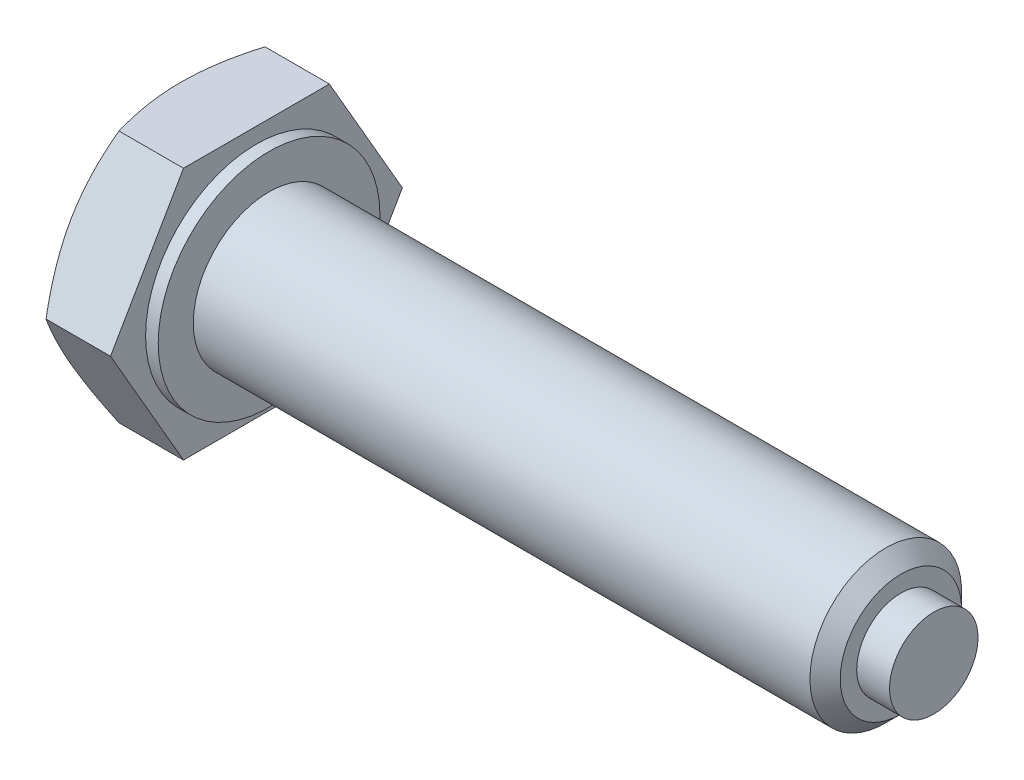
ISO-10303-21;
HEADER;
FILE_DESCRIPTION(('STEP AP214'),'2;1');
FILE_NAME('part.step','',(''),(''),'','','');
FILE_SCHEMA(('AUTOMOTIVE_DESIGN { 1 0 10303 214 1 1 1 1 }'));
ENDSEC;
DATA;
#1=APPLICATION_CONTEXT('core data for automotive mechanical design processes');
#2=APPLICATION_PROTOCOL_DEFINITION('international standard','automotive_design',2000,#1);
#3=PRODUCT_CONTEXT('',#1,'mechanical');
#4=PRODUCT('Part','Part','',(#3));
#5=PRODUCT_RELATED_PRODUCT_CATEGORY('part','',(#4));
#6=PRODUCT_DEFINITION_FORMATION('','',#4);
#7=PRODUCT_DEFINITION_CONTEXT('part definition',#1,'design');
#8=PRODUCT_DEFINITION('design','',#6,#7);
#9=PRODUCT_DEFINITION_SHAPE('','',#8);
#10=(LENGTH_UNIT() NAMED_UNIT(*) SI_UNIT(.MILLI.,.METRE.));
#11=(NAMED_UNIT(*) PLANE_ANGLE_UNIT() SI_UNIT($,.RADIAN.));
#12=(NAMED_UNIT(*) SI_UNIT($,.STERADIAN.) SOLID_ANGLE_UNIT());
#13=UNCERTAINTY_MEASURE_WITH_UNIT(LENGTH_MEASURE(1.E-05),#10,'distance_accuracy_value','');
#14=(GEOMETRIC_REPRESENTATION_CONTEXT(3) GLOBAL_UNCERTAINTY_ASSIGNED_CONTEXT((#13)) GLOBAL_UNIT_ASSIGNED_CONTEXT((#10,
#11,#12)) REPRESENTATION_CONTEXT('',''));
#15=CARTESIAN_POINT('',(0.,0.,0.));
#16=DIRECTION('',(0.,0.,1.));
#17=DIRECTION('',(1.,0.,0.));
#18=AXIS2_PLACEMENT_3D('',#15,#16,#17);
#19=CARTESIAN_POINT('',(6.5,-2.5,-4.33012701892221));
#20=DIRECTION('',(0.,-0.5,-0.866025403784439));
#21=DIRECTION('',(0.,-0.866025403784439,0.5));
#22=AXIS2_PLACEMENT_3D('',#19,#20,#21);
#23=PLANE('',#22);
#24=CARTESIAN_POINT('',(-3.05341801261481,-5.,-2.88675134594815));
#25=CARTESIAN_POINT('',(-3.5,-3.660254037848,-3.66025403784232));
#26=CARTESIAN_POINT('',(-3.5,-2.5,-4.33012701892221));
#27=B_SPLINE_CURVE_WITH_KNOTS('',2,(#24,#25,#26),.UNSPECIFIED.,.F.,.F.,(3,3),(0.,1.),.UNSPECIFIED.);
#28=CARTESIAN_POINT('',(-3.0534180126148,-5.,-2.88675134594811));
#29=VERTEX_POINT('',#28);
#30=CARTESIAN_POINT('',(-3.5,-2.5,-4.33012701892219));
#31=VERTEX_POINT('',#30);
#32=EDGE_CURVE('E218',#29,#31,#27,.T.);
#33=ORIENTED_EDGE('',*,*,#32,.T.);
#34=CARTESIAN_POINT('',(-3.5,-2.5,-4.33012701892221));
#35=CARTESIAN_POINT('',(-3.5,-1.88094418422438,-4.68753906080368));
#36=CARTESIAN_POINT('',(-3.37944642779345,-1.23558849293271,-5.06013534289397));
#37=CARTESIAN_POINT('',(-3.27002278937836,-0.649814330288887,-5.39833221338071));
#38=CARTESIAN_POINT('',(-3.05341801261481,0.,-5.77350269189627));
#39=B_SPLINE_CURVE_WITH_KNOTS('',2,(#34,#35,#36,#37,#38),.UNSPECIFIED.,.F.,.F.,(3,2,3),(0.,0.5,
1.),.UNSPECIFIED.);
#40=CARTESIAN_POINT('',(-3.05341801261481,0.,-5.77350269189625));
#41=VERTEX_POINT('',#40);
#42=EDGE_CURVE('E208',#31,#41,#39,.T.);
#43=ORIENTED_EDGE('',*,*,#42,.T.);
#44=DIRECTION('',(-1.,0.,0.));
#45=VECTOR('',#44,1.);
#46=CARTESIAN_POINT('',(6.5,0.,-5.77350269189626));
#47=LINE('',#46,#45);
#48=CARTESIAN_POINT('',(-0.5,0.,-5.77350269189629));
#49=VERTEX_POINT('',#48);
#50=EDGE_CURVE('E235',#49,#41,#47,.T.);
#51=ORIENTED_EDGE('',*,*,#50,.F.);
#52=DIRECTION('',(0.,-0.866025403784439,0.5));
#53=VECTOR('',#52,1.);
#54=CARTESIAN_POINT('',(-0.499999999999987,1.83012701892221,-6.83012701892217));
#55=LINE('',#54,#53);
#56=CARTESIAN_POINT('',(-0.5,-5.,-2.88675134594812));
#57=VERTEX_POINT('',#56);
#58=EDGE_CURVE('E503',#49,#57,#55,.T.);
#59=ORIENTED_EDGE('',*,*,#58,.T.);
#60=DIRECTION('',(-1.,0.,0.));
#61=VECTOR('',#60,1.);
#62=CARTESIAN_POINT('',(6.50000000000001,-5.,-2.88675134594812));
#63=LINE('',#62,#61);
#64=EDGE_CURVE('E11',#57,#29,#63,.T.);
#65=ORIENTED_EDGE('',*,*,#64,.T.);
#66=EDGE_LOOP('',(#33,#43,#51,#59,#65));
#67=FACE_BOUND('',#66,.T.);
#68=ADVANCED_FACE('F16',(#67),#23,.T.);
#69=CARTESIAN_POINT('',(6.5,-5.00000000000006,0.));
#70=DIRECTION('',(0.,-1.,0.));
#71=DIRECTION('',(0.,0.,-1.));
#72=AXIS2_PLACEMENT_3D('',#69,#70,#71);
#73=PLANE('',#72);
#74=CARTESIAN_POINT('',(-3.05341801261481,-5.00000000000006,2.88675134594809));
#75=CARTESIAN_POINT('',(-3.26907633651162,-5.00000000000006,2.13968899781922));
#76=CARTESIAN_POINT('',(-3.37864447292294,-5.00000000000006,1.46496446326328));
#77=CARTESIAN_POINT('',(-3.5,-5.00000000000006,0.717652751987256));
#78=CARTESIAN_POINT('',(-3.5,-5.00000000000006,0.));
#79=B_SPLINE_CURVE_WITH_KNOTS('',2,(#74,#75,#76,#77,#78),.UNSPECIFIED.,.F.,.F.,(3,2,3),(0.,0.5,
1.),.UNSPECIFIED.);
#80=CARTESIAN_POINT('',(-3.0534180126148,-5.,2.88675134594811));
#81=VERTEX_POINT('',#80);
#82=CARTESIAN_POINT('',(-3.49999999999999,-5.,0.));
#83=VERTEX_POINT('',#82);
#84=EDGE_CURVE('E161',#81,#83,#79,.T.);
#85=ORIENTED_EDGE('',*,*,#84,.T.);
#86=CARTESIAN_POINT('',(-3.5,-5.00000000000006,0.));
#87=CARTESIAN_POINT('',(-3.5,-5.00000000000006,-0.712189626387357));
#88=CARTESIAN_POINT('',(-3.3803501939515,-5.00000000000006,-1.45442210522949));
#89=CARTESIAN_POINT('',(-3.27090399188261,-5.00000000000006,-2.13335781389684));
#90=CARTESIAN_POINT('',(-3.05341801261481,-5.00000000000006,-2.88675134594814));
#91=B_SPLINE_CURVE_WITH_KNOTS('',2,(#86,#87,#88,#89,#90),.UNSPECIFIED.,.F.,.F.,(3,2,3),(0.,0.5,
1.),.UNSPECIFIED.);
#92=EDGE_CURVE('E492',#83,#29,#91,.T.);
#93=ORIENTED_EDGE('',*,*,#92,.T.);
#94=ORIENTED_EDGE('',*,*,#64,.F.);
#95=DIRECTION('',(0.,0.,1.));
#96=VECTOR('',#95,1.);
#97=CARTESIAN_POINT('',(-0.499999999999994,-5.,0.));
#98=LINE('',#97,#96);
#99=CARTESIAN_POINT('',(-0.499999999999994,-5.,2.88675134594812));
#100=VERTEX_POINT('',#99);
#101=EDGE_CURVE('E157',#57,#100,#98,.T.);
#102=ORIENTED_EDGE('',*,*,#101,.T.);
#103=DIRECTION('',(-1.,0.,0.));
#104=VECTOR('',#103,1.);
#105=CARTESIAN_POINT('',(6.50000000000001,-5.,2.88675134594807));
#106=LINE('',#105,#104);
#107=EDGE_CURVE('E29',#100,#81,#106,.T.);
#108=ORIENTED_EDGE('',*,*,#107,.T.);
#109=EDGE_LOOP('',(#85,#93,#94,#102,#108));
#110=FACE_BOUND('',#109,.T.);
#111=ADVANCED_FACE('F394',(#110),#73,.T.);
#112=CARTESIAN_POINT('',(6.50000000000001,-2.5,4.33012701892217));
#113=DIRECTION('',(0.,-0.5,0.866025403784439));
#114=DIRECTION('',(-1.,0.,0.));
#115=AXIS2_PLACEMENT_3D('',#112,#113,#114);
#116=PLANE('',#115);
#117=CARTESIAN_POINT('',(-3.0534180126148,0.,5.77350269189623));
#118=CARTESIAN_POINT('',(-3.49999999999999,-1.339745962152,5.00000000000206));
#119=CARTESIAN_POINT('',(-3.49999999999999,-2.5,4.33012701892217));
#120=B_SPLINE_CURVE_WITH_KNOTS('',2,(#117,#118,#119),.UNSPECIFIED.,.F.,.F.,(3,3),(0.,1.),.UNSPECIFIED.);
#121=CARTESIAN_POINT('',(-3.0534180126148,0.,5.77350269189621));
#122=VERTEX_POINT('',#121);
#123=CARTESIAN_POINT('',(-3.5,-2.5,4.33012701892216));
#124=VERTEX_POINT('',#123);
#125=EDGE_CURVE('E356',#122,#124,#120,.T.);
#126=ORIENTED_EDGE('',*,*,#125,.T.);
#127=CARTESIAN_POINT('',(-3.49999999999999,-2.5,4.33012701892217));
#128=CARTESIAN_POINT('',(-3.49999999999999,-3.11905581578245,3.97271497703677));
#129=CARTESIAN_POINT('',(-3.37944642779343,-3.76441150706729,3.60011869495041));
#130=CARTESIAN_POINT('',(-3.27002278937571,-4.35018566971901,3.26192182445911));
#131=CARTESIAN_POINT('',(-3.0534180126148,-4.99999999999999,2.88675134594811));
#132=B_SPLINE_CURVE_WITH_KNOTS('',2,(#127,#128,#129,#130,#131),.UNSPECIFIED.,.F.,.F.,(3,2,3),
(0.,0.5,1.),.UNSPECIFIED.);
#133=EDGE_CURVE('E368',#124,#81,#132,.T.);
#134=ORIENTED_EDGE('',*,*,#133,.T.);
#135=ORIENTED_EDGE('',*,*,#107,.F.);
#136=DIRECTION('',(0.,0.866025403784439,0.5));
#137=VECTOR('',#136,1.);
#138=CARTESIAN_POINT('',(-0.499999999999994,1.83012701892221,6.83012701892215));
#139=LINE('',#138,#137);
#140=CARTESIAN_POINT('',(-0.49999999999999,0.,5.77350269189623));
#141=VERTEX_POINT('',#140);
#142=EDGE_CURVE('E155',#100,#141,#139,.T.);
#143=ORIENTED_EDGE('',*,*,#142,.T.);
#144=DIRECTION('',(-1.,0.,0.));
#145=VECTOR('',#144,1.);
#146=CARTESIAN_POINT('',(6.50000000000001,0.,5.77350269189622));
#147=LINE('',#146,#145);
#148=EDGE_CURVE('E409',#141,#122,#147,.T.);
#149=ORIENTED_EDGE('',*,*,#148,.T.);
#150=EDGE_LOOP('',(#126,#134,#135,#143,#149));
#151=FACE_BOUND('',#150,.T.);
#152=ADVANCED_FACE('F336',(#151),#116,.T.);
#153=CARTESIAN_POINT('',(6.5,2.5,4.33012701892214));
#154=DIRECTION('',(0.,0.5,0.866025403784439));
#155=DIRECTION('',(1.,0.,0.));
#156=AXIS2_PLACEMENT_3D('',#153,#154,#155);
#157=PLANE('',#156);
#158=CARTESIAN_POINT('',(-3.05341801261481,4.99999999999999,2.88675134594808));
#159=CARTESIAN_POINT('',(-3.5,3.660254037848,3.66025403784225));
#160=CARTESIAN_POINT('',(-3.5,2.5,4.33012701892214));
#161=B_SPLINE_CURVE_WITH_KNOTS('',2,(#158,#159,#160),.UNSPECIFIED.,.F.,.F.,(3,3),(0.,1.),.UNSPECIFIED.);
#162=CARTESIAN_POINT('',(-3.0534180126148,5.,2.88675134594808));
#163=VERTEX_POINT('',#162);
#164=CARTESIAN_POINT('',(-3.5,2.5,4.33012701892216));
#165=VERTEX_POINT('',#164);
#166=EDGE_CURVE('E313',#163,#165,#161,.T.);
#167=ORIENTED_EDGE('',*,*,#166,.T.);
#168=CARTESIAN_POINT('',(-3.5,2.5,4.33012701892214));
#169=CARTESIAN_POINT('',(-3.5,1.88094418422412,4.68753906080376));
#170=CARTESIAN_POINT('',(-3.37944642779345,1.23558849293271,5.0601353428939));
#171=CARTESIAN_POINT('',(-3.27002278937826,0.649814330288593,5.39833221338081));
#172=CARTESIAN_POINT('',(-3.05341801261481,0.,5.7735026918962));
#173=B_SPLINE_CURVE_WITH_KNOTS('',2,(#168,#169,#170,#171,#172),.UNSPECIFIED.,.F.,.F.,(3,2,3),
(0.,0.5,1.),.UNSPECIFIED.);
#174=EDGE_CURVE('E314',#165,#122,#173,.T.);
#175=ORIENTED_EDGE('',*,*,#174,.T.);
#176=ORIENTED_EDGE('',*,*,#148,.F.);
#177=DIRECTION('',(0.,0.866025403784439,-0.5));
#178=VECTOR('',#177,1.);
#179=CARTESIAN_POINT('',(-0.499999999999997,6.83012701892216,1.83012701892216));
#180=LINE('',#179,#178);
#181=CARTESIAN_POINT('',(-0.499999999999997,4.99999999999995,2.88675134594811));
#182=VERTEX_POINT('',#181);
#183=EDGE_CURVE('E151',#141,#182,#180,.T.);
#184=ORIENTED_EDGE('',*,*,#183,.T.);
#185=DIRECTION('',(-1.,0.,0.));
#186=VECTOR('',#185,1.);
#187=CARTESIAN_POINT('',(6.5,4.99999999999995,2.8867513459481));
#188=LINE('',#187,#186);
#189=EDGE_CURVE('E280',#182,#163,#188,.T.);
#190=ORIENTED_EDGE('',*,*,#189,.T.);
#191=EDGE_LOOP('',(#167,#175,#176,#184,#190));
#192=FACE_BOUND('',#191,.T.);
#193=ADVANCED_FACE('F255',(#192),#157,.T.);
#194=CARTESIAN_POINT('',(6.50000000000001,5.,0.));
#195=DIRECTION('',(0.,1.,0.));
#196=DIRECTION('',(0.,0.,-1.));
#197=AXIS2_PLACEMENT_3D('',#194,#195,#196);
#198=PLANE('',#197);
#199=CARTESIAN_POINT('',(-3.0534180126148,5.00000000000001,-2.88675134594815));
#200=CARTESIAN_POINT('',(-3.27073255317133,5.00000000000001,-2.13395169501346));
#201=CARTESIAN_POINT('',(-3.38035019395149,5.00000000000001,-1.45442210522949));
#202=CARTESIAN_POINT('',(-3.49999999999999,5.,-0.712702222889343));
#203=CARTESIAN_POINT('',(-3.49999999999999,5.,0.));
#204=B_SPLINE_CURVE_WITH_KNOTS('',2,(#199,#200,#201,#202,#203),.UNSPECIFIED.,.F.,.F.,(3,2,3),
(0.,0.5,1.),.UNSPECIFIED.);
#205=CARTESIAN_POINT('',(-3.0534180126148,4.99999999999995,-2.88675134594814));
#206=VERTEX_POINT('',#205);
#207=CARTESIAN_POINT('',(-3.5,4.99999999999995,0.));
#208=VERTEX_POINT('',#207);
#209=EDGE_CURVE('E241',#206,#208,#204,.T.);
#210=ORIENTED_EDGE('',*,*,#209,.T.);
#211=CARTESIAN_POINT('',(-3.49999999999999,5.,0.));
#212=CARTESIAN_POINT('',(-3.49999999999999,5.,0.717140252018308));
#213=CARTESIAN_POINT('',(-3.37864447292293,5.,1.46496446326328));
#214=CARTESIAN_POINT('',(-3.26924783142741,5.,2.13909492200443));
#215=CARTESIAN_POINT('',(-3.0534180126148,5.,2.88675134594809));
#216=B_SPLINE_CURVE_WITH_KNOTS('',2,(#211,#212,#213,#214,#215),.UNSPECIFIED.,.F.,.F.,(3,2,3),
(0.,0.5,1.),.UNSPECIFIED.);
#217=EDGE_CURVE('E275',#208,#163,#216,.T.);
#218=ORIENTED_EDGE('',*,*,#217,.T.);
#219=ORIENTED_EDGE('',*,*,#189,.F.);
#220=DIRECTION('',(0.,0.,-1.));
#221=VECTOR('',#220,1.);
#222=CARTESIAN_POINT('',(-0.5,4.99999999999995,0.));
#223=LINE('',#222,#221);
#224=CARTESIAN_POINT('',(-0.5,5.,-2.88675134594815));
#225=VERTEX_POINT('',#224);
#226=EDGE_CURVE('E156',#182,#225,#223,.T.);
#227=ORIENTED_EDGE('',*,*,#226,.T.);
#228=DIRECTION('',(-1.,0.,0.));
#229=VECTOR('',#228,1.);
#230=CARTESIAN_POINT('',(6.50000000000001,5.,-2.88675134594814));
#231=LINE('',#230,#229);
#232=EDGE_CURVE('E44',#225,#206,#231,.T.);
#233=ORIENTED_EDGE('',*,*,#232,.T.);
#234=EDGE_LOOP('',(#210,#218,#219,#227,#233));
#235=FACE_BOUND('',#234,.T.);
#236=ADVANCED_FACE('F184',(#235),#198,.T.);
#237=CARTESIAN_POINT('',(6.5,2.5,-4.3301270189222));
#238=DIRECTION('',(0.,0.5,-0.866025403784439));
#239=DIRECTION('',(-1.,0.,0.));
#240=AXIS2_PLACEMENT_3D('',#237,#238,#239);
#241=PLANE('',#240);
#242=CARTESIAN_POINT('',(-3.05341801261481,0.,-5.77350269189626));
#243=CARTESIAN_POINT('',(-3.5,1.339745962152,-5.0000000000021));
#244=CARTESIAN_POINT('',(-3.5,2.5,-4.3301270189222));
#245=B_SPLINE_CURVE_WITH_KNOTS('',2,(#242,#243,#244),.UNSPECIFIED.,.F.,.F.,(3,3),(0.,1.),.UNSPECIFIED.);
#246=CARTESIAN_POINT('',(-3.49999999999999,2.5,-4.33012701892217));
#247=VERTEX_POINT('',#246);
#248=EDGE_CURVE('E205',#41,#247,#245,.T.);
#249=ORIENTED_EDGE('',*,*,#248,.T.);
#250=CARTESIAN_POINT('',(-3.5,2.5,-4.3301270189222));
#251=CARTESIAN_POINT('',(-3.5,3.11905581577575,-3.97271497704067));
#252=CARTESIAN_POINT('',(-3.37944642779344,3.76441150706729,-3.60011869495044));
#253=CARTESIAN_POINT('',(-3.27002278937831,4.35018566971127,-3.26192182446361));
#254=CARTESIAN_POINT('',(-3.05341801261481,4.99999999999999,-2.88675134594814));
#255=B_SPLINE_CURVE_WITH_KNOTS('',2,(#250,#251,#252,#253,#254),.UNSPECIFIED.,.F.,.F.,(3,2,3),
(0.,0.5,1.),.UNSPECIFIED.);
#256=EDGE_CURVE('E166',#247,#206,#255,.T.);
#257=ORIENTED_EDGE('',*,*,#256,.T.);
#258=ORIENTED_EDGE('',*,*,#232,.F.);
#259=DIRECTION('',(0.,-0.866025403784439,-0.5));
#260=VECTOR('',#259,1.);
#261=CARTESIAN_POINT('',(-0.499999999999994,6.83012701892216,-1.8301270189222));
#262=LINE('',#261,#260);
#263=EDGE_CURVE('E508',#225,#49,#262,.T.);
#264=ORIENTED_EDGE('',*,*,#263,.T.);
#265=ORIENTED_EDGE('',*,*,#50,.T.);
#266=EDGE_LOOP('',(#249,#257,#258,#264,#265));
#267=FACE_BOUND('',#266,.T.);
#268=ADVANCED_FACE('F173',(#267),#241,.T.);
#269=CARTESIAN_POINT('',(-3.5,0.,0.));
#270=DIRECTION('',(1.,0.,0.));
#271=DIRECTION('',(0.,1.,0.));
#272=AXIS2_PLACEMENT_3D('',#269,#270,#271);
#273=PLANE('',#272);
#274=CARTESIAN_POINT('',(-3.5,0.,0.));
#275=DIRECTION('',(-1.,0.,0.));
#276=DIRECTION('',(0.,0.,1.));
#277=AXIS2_PLACEMENT_3D('',#274,#275,#276);
#278=CIRCLE('',#277,5.);
#279=EDGE_CURVE('E211',#247,#31,#278,.T.);
#280=ORIENTED_EDGE('',*,*,#279,.T.);
#281=CARTESIAN_POINT('',(-3.5,0.,0.));
#282=DIRECTION('',(-1.,0.,0.));
#283=DIRECTION('',(0.,0.,1.));
#284=AXIS2_PLACEMENT_3D('',#281,#282,#283);
#285=CIRCLE('',#284,5.);
#286=EDGE_CURVE('E496',#31,#83,#285,.T.);
#287=ORIENTED_EDGE('',*,*,#286,.T.);
#288=CARTESIAN_POINT('',(-3.5,0.,0.));
#289=DIRECTION('',(-1.,0.,0.));
#290=DIRECTION('',(0.,0.,1.));
#291=AXIS2_PLACEMENT_3D('',#288,#289,#290);
#292=CIRCLE('',#291,5.);
#293=EDGE_CURVE('E352',#83,#124,#292,.T.);
#294=ORIENTED_EDGE('',*,*,#293,.T.);
#295=CARTESIAN_POINT('',(-3.5,0.,0.));
#296=DIRECTION('',(-1.,0.,0.));
#297=DIRECTION('',(0.,0.,1.));
#298=AXIS2_PLACEMENT_3D('',#295,#296,#297);
#299=CIRCLE('',#298,5.);
#300=EDGE_CURVE('E304',#124,#165,#299,.T.);
#301=ORIENTED_EDGE('',*,*,#300,.T.);
#302=CARTESIAN_POINT('',(-3.5,0.,0.));
#303=DIRECTION('',(-1.,0.,0.));
#304=DIRECTION('',(0.,0.,1.));
#305=AXIS2_PLACEMENT_3D('',#302,#303,#304);
#306=CIRCLE('',#305,5.);
#307=EDGE_CURVE('E351',#165,#208,#306,.T.);
#308=ORIENTED_EDGE('',*,*,#307,.T.);
#309=CARTESIAN_POINT('',(-3.5,0.,0.));
#310=DIRECTION('',(-1.,0.,0.));
#311=DIRECTION('',(0.,0.,1.));
#312=AXIS2_PLACEMENT_3D('',#309,#310,#311);
#313=CIRCLE('',#312,5.);
#314=EDGE_CURVE('E236',#208,#247,#313,.T.);
#315=ORIENTED_EDGE('',*,*,#314,.T.);
#316=EDGE_LOOP('',(#280,#287,#294,#301,#308,#315));
#317=FACE_BOUND('',#316,.T.);
#318=ADVANCED_FACE('F183',(#317),#273,.F.);
#319=CARTESIAN_POINT('',(26.3,1.74999999999997,0.));
#320=DIRECTION('',(-1.,0.,0.));
#321=DIRECTION('',(0.,0.,1.));
#322=AXIS2_PLACEMENT_3D('',#319,#320,#321);
#323=PLANE('',#322);
#324=CARTESIAN_POINT('',(26.3,0.,0.));
#325=DIRECTION('',(-1.,0.,0.));
#326=DIRECTION('',(0.,0.,1.));
#327=AXIS2_PLACEMENT_3D('',#324,#325,#326);
#328=CIRCLE('',#327,1.75);
#329=CARTESIAN_POINT('',(26.3,0.,-1.75));
#330=VERTEX_POINT('',#329);
#331=EDGE_CURVE('E619',#330,#330,#328,.T.);
#332=ORIENTED_EDGE('',*,*,#331,.F.);
#333=EDGE_LOOP('',(#332));
#334=FACE_BOUND('',#333,.T.);
#335=ADVANCED_FACE('F337',(#334),#323,.F.);
#336=CARTESIAN_POINT('',(25.,2.40000000000001,0.));
#337=DIRECTION('',(-1.,0.,0.));
#338=DIRECTION('',(0.,0.,1.));
#339=AXIS2_PLACEMENT_3D('',#336,#337,#338);
#340=PLANE('',#339);
#341=CARTESIAN_POINT('',(25.,0.,0.));
#342=DIRECTION('',(-1.,0.,0.));
#343=DIRECTION('',(0.,0.,1.));
#344=AXIS2_PLACEMENT_3D('',#341,#342,#343);
#345=CIRCLE('',#344,1.75);
#346=CARTESIAN_POINT('',(25.,0.,1.74999999999997));
#347=VERTEX_POINT('',#346);
#348=EDGE_CURVE('E624',#347,#347,#345,.T.);
#349=ORIENTED_EDGE('',*,*,#348,.T.);
#350=EDGE_LOOP('',(#349));
#351=FACE_BOUND('',#350,.T.);
#352=CARTESIAN_POINT('',(25.,0.,0.));
#353=DIRECTION('',(-1.,0.,0.));
#354=DIRECTION('',(0.,0.,1.));
#355=AXIS2_PLACEMENT_3D('',#352,#353,#354);
#356=CIRCLE('',#355,2.4);
#357=CARTESIAN_POINT('',(25.,0.,-2.40000000000001));
#358=VERTEX_POINT('',#357);
#359=EDGE_CURVE('E146',#358,#358,#356,.T.);
#360=ORIENTED_EDGE('',*,*,#359,.F.);
#361=EDGE_LOOP('',(#360));
#362=FACE_BOUND('',#361,.T.);
#363=ADVANCED_FACE('F295',(#351,#362),#340,.F.);
#364=CARTESIAN_POINT('',(0.,4.38675134594807,0.));
#365=DIRECTION('',(-1.,0.,0.));
#366=DIRECTION('',(0.,0.,1.));
#367=AXIS2_PLACEMENT_3D('',#364,#365,#366);
#368=PLANE('',#367);
#369=CARTESIAN_POINT('',(0.,0.,0.));
#370=DIRECTION('',(-1.,0.,0.));
#371=DIRECTION('',(0.,0.,1.));
#372=AXIS2_PLACEMENT_3D('',#369,#370,#371);
#373=CIRCLE('',#372,3.);
#374=CARTESIAN_POINT('',(0.,0.,2.99999999999999));
#375=VERTEX_POINT('',#374);
#376=EDGE_CURVE('E131',#375,#375,#373,.T.);
#377=ORIENTED_EDGE('',*,*,#376,.T.);
#378=EDGE_LOOP('',(#377));
#379=FACE_BOUND('',#378,.T.);
#380=CARTESIAN_POINT('',(0.,0.,0.));
#381=DIRECTION('',(-1.,0.,0.));
#382=DIRECTION('',(0.,0.,1.));
#383=AXIS2_PLACEMENT_3D('',#380,#381,#382);
#384=CIRCLE('',#383,4.38675134594812);
#385=CARTESIAN_POINT('',(0.,0.,-4.38675134594813));
#386=VERTEX_POINT('',#385);
#387=EDGE_CURVE('E136',#386,#386,#384,.T.);
#388=ORIENTED_EDGE('',*,*,#387,.F.);
#389=EDGE_LOOP('',(#388));
#390=FACE_BOUND('',#389,.T.);
#391=ADVANCED_FACE('F132',(#379,#390),#368,.F.);
#392=CARTESIAN_POINT('',(-3.0534180126148,0.,0.));
#393=DIRECTION('',(1.,0.,0.));
#394=DIRECTION('',(0.,0.,-1.));
#395=AXIS2_PLACEMENT_3D('',#392,#393,#394);
#396=CONICAL_SURFACE('',#395,5.77350269189624,1.0471975511966);
#397=ORIENTED_EDGE('',*,*,#209,.F.);
#398=ORIENTED_EDGE('',*,*,#256,.F.);
#399=ORIENTED_EDGE('',*,*,#314,.F.);
#400=EDGE_LOOP('',(#397,#398,#399));
#401=FACE_BOUND('',#400,.T.);
#402=ADVANCED_FACE('F292',(#401),#396,.T.);
#403=CARTESIAN_POINT('',(-3.0534180126148,0.,0.));
#404=DIRECTION('',(1.,0.,0.));
#405=DIRECTION('',(0.,0.,-1.));
#406=AXIS2_PLACEMENT_3D('',#403,#404,#405);
#407=CONICAL_SURFACE('',#406,5.77350269189624,1.0471975511966);
#408=ORIENTED_EDGE('',*,*,#166,.F.);
#409=ORIENTED_EDGE('',*,*,#217,.F.);
#410=ORIENTED_EDGE('',*,*,#307,.F.);
#411=EDGE_LOOP('',(#408,#409,#410));
#412=FACE_BOUND('',#411,.T.);
#413=ADVANCED_FACE('F282',(#412),#407,.T.);
#414=CARTESIAN_POINT('',(-3.0534180126148,0.,0.));
#415=DIRECTION('',(1.,0.,0.));
#416=DIRECTION('',(0.,0.,-1.));
#417=AXIS2_PLACEMENT_3D('',#414,#415,#416);
#418=CONICAL_SURFACE('',#417,5.77350269189624,1.0471975511966);
#419=ORIENTED_EDGE('',*,*,#125,.F.);
#420=ORIENTED_EDGE('',*,*,#174,.F.);
#421=ORIENTED_EDGE('',*,*,#300,.F.);
#422=EDGE_LOOP('',(#419,#420,#421));
#423=FACE_BOUND('',#422,.T.);
#424=ADVANCED_FACE('F256',(#423),#418,.T.);
#425=CARTESIAN_POINT('',(-3.0534180126148,0.,0.));
#426=DIRECTION('',(1.,0.,0.));
#427=DIRECTION('',(0.,0.,-1.));
#428=AXIS2_PLACEMENT_3D('',#425,#426,#427);
#429=CONICAL_SURFACE('',#428,5.77350269189624,1.0471975511966);
#430=ORIENTED_EDGE('',*,*,#84,.F.);
#431=ORIENTED_EDGE('',*,*,#133,.F.);
#432=ORIENTED_EDGE('',*,*,#293,.F.);
#433=EDGE_LOOP('',(#430,#431,#432));
#434=FACE_BOUND('',#433,.T.);
#435=ADVANCED_FACE('F185',(#434),#429,.T.);
#436=CARTESIAN_POINT('',(-0.499999999999994,5.77350269189619,0.));
#437=DIRECTION('',(-1.,0.,0.));
#438=DIRECTION('',(0.,0.,1.));
#439=AXIS2_PLACEMENT_3D('',#436,#437,#438);
#440=PLANE('',#439);
#441=CARTESIAN_POINT('',(-0.499999999999994,0.,0.));
#442=DIRECTION('',(-1.,0.,0.));
#443=DIRECTION('',(0.,0.,1.));
#444=AXIS2_PLACEMENT_3D('',#441,#442,#443);
#445=CIRCLE('',#444,4.38675134594811);
#446=CARTESIAN_POINT('',(-0.499999999999994,0.,4.38675134594811));
#447=VERTEX_POINT('',#446);
#448=EDGE_CURVE('E144',#447,#447,#445,.T.);
#449=ORIENTED_EDGE('',*,*,#448,.T.);
#450=EDGE_LOOP('',(#449));
#451=FACE_BOUND('',#450,.T.);
#452=ORIENTED_EDGE('',*,*,#58,.F.);
#453=ORIENTED_EDGE('',*,*,#263,.F.);
#454=ORIENTED_EDGE('',*,*,#226,.F.);
#455=ORIENTED_EDGE('',*,*,#183,.F.);
#456=ORIENTED_EDGE('',*,*,#142,.F.);
#457=ORIENTED_EDGE('',*,*,#101,.F.);
#458=EDGE_LOOP('',(#452,#453,#454,#455,#456,#457));
#459=FACE_BOUND('',#458,.T.);
#460=ADVANCED_FACE('F395',(#451,#459),#440,.F.);
#461=CARTESIAN_POINT('',(-3.0534180126148,0.,0.));
#462=DIRECTION('',(1.,0.,0.));
#463=DIRECTION('',(0.,0.,-1.));
#464=AXIS2_PLACEMENT_3D('',#461,#462,#463);
#465=CONICAL_SURFACE('',#464,5.77350269189624,1.0471975511966);
#466=ORIENTED_EDGE('',*,*,#32,.F.);
#467=ORIENTED_EDGE('',*,*,#92,.F.);
#468=ORIENTED_EDGE('',*,*,#286,.F.);
#469=EDGE_LOOP('',(#466,#467,#468));
#470=FACE_BOUND('',#469,.T.);
#471=ADVANCED_FACE('F458',(#470),#465,.T.);
#472=CARTESIAN_POINT('',(-3.0534180126148,0.,0.));
#473=DIRECTION('',(1.,0.,0.));
#474=DIRECTION('',(0.,0.,-1.));
#475=AXIS2_PLACEMENT_3D('',#472,#473,#474);
#476=CONICAL_SURFACE('',#475,5.77350269189624,1.0471975511966);
#477=ORIENTED_EDGE('',*,*,#279,.F.);
#478=ORIENTED_EDGE('',*,*,#248,.F.);
#479=ORIENTED_EDGE('',*,*,#42,.F.);
#480=EDGE_LOOP('',(#477,#478,#479));
#481=FACE_BOUND('',#480,.T.);
#482=ADVANCED_FACE('F206',(#481),#476,.T.);
#483=CARTESIAN_POINT('',(0.,0.,0.));
#484=DIRECTION('',(-1.,0.,0.));
#485=DIRECTION('',(0.,0.,1.));
#486=AXIS2_PLACEMENT_3D('',#483,#484,#485);
#487=CYLINDRICAL_SURFACE('',#486,4.38675134594811);
#488=ORIENTED_EDGE('',*,*,#448,.F.);
#489=EDGE_LOOP('',(#488));
#490=FACE_BOUND('',#489,.T.);
#491=ORIENTED_EDGE('',*,*,#387,.T.);
#492=EDGE_LOOP('',(#491));
#493=FACE_BOUND('',#492,.T.);
#494=ADVANCED_FACE('F188',(#490,#493),#487,.T.);
#495=CARTESIAN_POINT('',(0.,0.,0.));
#496=DIRECTION('',(-1.,0.,0.));
#497=DIRECTION('',(0.,0.,1.));
#498=AXIS2_PLACEMENT_3D('',#495,#496,#497);
#499=CYLINDRICAL_SURFACE('',#498,3.);
#500=ORIENTED_EDGE('',*,*,#376,.F.);
#501=EDGE_LOOP('',(#500));
#502=FACE_BOUND('',#501,.T.);
#503=CARTESIAN_POINT('',(24.4,0.,0.));
#504=DIRECTION('',(-1.,0.,0.));
#505=DIRECTION('',(0.,0.,1.));
#506=AXIS2_PLACEMENT_3D('',#503,#504,#505);
#507=CIRCLE('',#506,3.);
#508=CARTESIAN_POINT('',(24.4,0.,2.99999999999999));
#509=VERTEX_POINT('',#508);
#510=EDGE_CURVE('E137',#509,#509,#507,.T.);
#511=ORIENTED_EDGE('',*,*,#510,.T.);
#512=EDGE_LOOP('',(#511));
#513=FACE_BOUND('',#512,.T.);
#514=ADVANCED_FACE('F787',(#502,#513),#499,.T.);
#515=CARTESIAN_POINT('',(25.,0.,0.));
#516=DIRECTION('',(-1.,0.,0.));
#517=DIRECTION('',(0.,0.,1.));
#518=AXIS2_PLACEMENT_3D('',#515,#516,#517);
#519=CONICAL_SURFACE('',#518,2.4,0.785398163397446);
#520=ORIENTED_EDGE('',*,*,#510,.F.);
#521=EDGE_LOOP('',(#520));
#522=FACE_BOUND('',#521,.T.);
#523=ORIENTED_EDGE('',*,*,#359,.T.);
#524=EDGE_LOOP('',(#523));
#525=FACE_BOUND('',#524,.T.);
#526=ADVANCED_FACE('F293',(#522,#525),#519,.T.);
#527=CARTESIAN_POINT('',(0.,0.,0.));
#528=DIRECTION('',(-1.,0.,0.));
#529=DIRECTION('',(0.,0.,1.));
#530=AXIS2_PLACEMENT_3D('',#527,#528,#529);
#531=CYLINDRICAL_SURFACE('',#530,1.75);
#532=ORIENTED_EDGE('',*,*,#348,.F.);
#533=EDGE_LOOP('',(#532));
#534=FACE_BOUND('',#533,.T.);
#535=ORIENTED_EDGE('',*,*,#331,.T.);
#536=EDGE_LOOP('',(#535));
#537=FACE_BOUND('',#536,.T.);
#538=ADVANCED_FACE('F670',(#534,#537),#531,.T.);
#539=CLOSED_SHELL('',(#68,#111,#152,#193,#236,#268,#318,#335,#363,#391,#402,#413,#424,#435,#460,
#471,#482,#494,#514,#526,#538));
#540=MANIFOLD_SOLID_BREP('B1',#539);
#541=ADVANCED_BREP_SHAPE_REPRESENTATION('',(#18,#540),#14);
#542=SHAPE_DEFINITION_REPRESENTATION(#9,#541);
ENDSEC;
END-ISO-10303-21;
